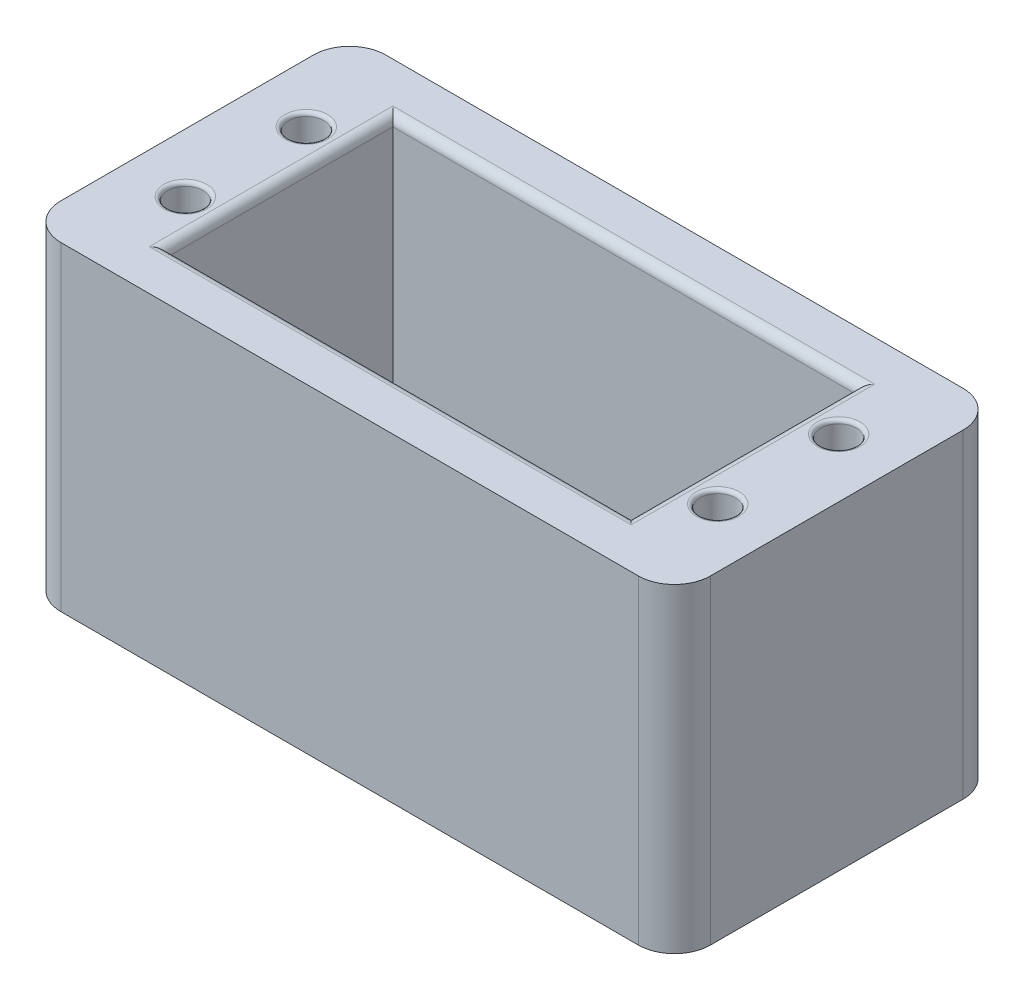
ISO-10303-21;
HEADER;
FILE_DESCRIPTION(('STEP AP214'),'2;1');
FILE_NAME('part.step','',(''),(''),'','','');
FILE_SCHEMA(('AUTOMOTIVE_DESIGN { 1 0 10303 214 1 1 1 1 }'));
ENDSEC;
DATA;
#1=APPLICATION_CONTEXT('core data for automotive mechanical design processes');
#2=APPLICATION_PROTOCOL_DEFINITION('international standard','automotive_design',2000,#1);
#3=PRODUCT_CONTEXT('',#1,'mechanical');
#4=PRODUCT('Part','Part','',(#3));
#5=PRODUCT_RELATED_PRODUCT_CATEGORY('part','',(#4));
#6=PRODUCT_DEFINITION_FORMATION('','',#4);
#7=PRODUCT_DEFINITION_CONTEXT('part definition',#1,'design');
#8=PRODUCT_DEFINITION('design','',#6,#7);
#9=PRODUCT_DEFINITION_SHAPE('','',#8);
#10=(LENGTH_UNIT() NAMED_UNIT(*) SI_UNIT(.MILLI.,.METRE.));
#11=(NAMED_UNIT(*) PLANE_ANGLE_UNIT() SI_UNIT($,.RADIAN.));
#12=(NAMED_UNIT(*) SI_UNIT($,.STERADIAN.) SOLID_ANGLE_UNIT());
#13=UNCERTAINTY_MEASURE_WITH_UNIT(LENGTH_MEASURE(1.E-05),#10,'distance_accuracy_value','');
#14=(GEOMETRIC_REPRESENTATION_CONTEXT(3) GLOBAL_UNCERTAINTY_ASSIGNED_CONTEXT((#13)) GLOBAL_UNIT_ASSIGNED_CONTEXT((#10,
#11,#12)) REPRESENTATION_CONTEXT('',''));
#15=CARTESIAN_POINT('',(0.,0.,0.));
#16=DIRECTION('',(0.,0.,1.));
#17=DIRECTION('',(1.,0.,0.));
#18=AXIS2_PLACEMENT_3D('',#15,#16,#17);
#19=CARTESIAN_POINT('',(45.72,45.,-22.86));
#20=DIRECTION('',(-1.,0.,0.));
#21=DIRECTION('',(0.,0.,1.));
#22=AXIS2_PLACEMENT_3D('',#19,#20,#21);
#23=PLANE('',#22);
#24=DIRECTION('',(0.,0.,-1.));
#25=VECTOR('',#24,1.);
#26=CARTESIAN_POINT('',(45.72,45.,-22.86));
#27=LINE('',#26,#25);
#28=CARTESIAN_POINT('',(45.72,45.,17.78));
#29=VERTEX_POINT('',#28);
#30=CARTESIAN_POINT('',(45.72,45.,-17.78));
#31=VERTEX_POINT('',#30);
#32=EDGE_CURVE('E174',#29,#31,#27,.T.);
#33=ORIENTED_EDGE('',*,*,#32,.F.);
#34=DIRECTION('',(0.,-1.,0.));
#35=VECTOR('',#34,1.);
#36=CARTESIAN_POINT('',(45.72,45.,17.78));
#37=LINE('',#36,#35);
#38=CARTESIAN_POINT('',(45.72,0.,17.78));
#39=VERTEX_POINT('',#38);
#40=EDGE_CURVE('E230',#29,#39,#37,.T.);
#41=ORIENTED_EDGE('',*,*,#40,.T.);
#42=DIRECTION('',(0.,0.,-1.));
#43=VECTOR('',#42,1.);
#44=CARTESIAN_POINT('',(45.72,0.,-22.86));
#45=LINE('',#44,#43);
#46=CARTESIAN_POINT('',(45.72,0.,-17.78));
#47=VERTEX_POINT('',#46);
#48=EDGE_CURVE('E170',#39,#47,#45,.T.);
#49=ORIENTED_EDGE('',*,*,#48,.T.);
#50=DIRECTION('',(0.,-1.,0.));
#51=VECTOR('',#50,1.);
#52=CARTESIAN_POINT('',(45.72,45.,-17.78));
#53=LINE('',#52,#51);
#54=EDGE_CURVE('E228',#47,#31,#53,.F.);
#55=ORIENTED_EDGE('',*,*,#54,.T.);
#56=EDGE_LOOP('',(#33,#41,#49,#55));
#57=FACE_BOUND('',#56,.T.);
#58=ADVANCED_FACE('F37',(#57),#23,.F.);
#59=CARTESIAN_POINT('',(-45.72,45.,-22.86));
#60=DIRECTION('',(0.,0.,1.));
#61=DIRECTION('',(1.,0.,0.));
#62=AXIS2_PLACEMENT_3D('',#59,#60,#61);
#63=PLANE('',#62);
#64=DIRECTION('',(-1.,0.,0.));
#65=VECTOR('',#64,1.);
#66=CARTESIAN_POINT('',(-45.72,0.,-22.86));
#67=LINE('',#66,#65);
#68=CARTESIAN_POINT('',(40.64,0.,-22.86));
#69=VERTEX_POINT('',#68);
#70=CARTESIAN_POINT('',(-40.64,0.,-22.86));
#71=VERTEX_POINT('',#70);
#72=EDGE_CURVE('E190',#69,#71,#67,.T.);
#73=ORIENTED_EDGE('',*,*,#72,.T.);
#74=DIRECTION('',(0.,-1.,0.));
#75=VECTOR('',#74,1.);
#76=CARTESIAN_POINT('',(-40.64,45.,-22.86));
#77=LINE('',#76,#75);
#78=CARTESIAN_POINT('',(-40.64,45.,-22.86));
#79=VERTEX_POINT('',#78);
#80=EDGE_CURVE('E226',#71,#79,#77,.F.);
#81=ORIENTED_EDGE('',*,*,#80,.T.);
#82=DIRECTION('',(-1.,0.,0.));
#83=VECTOR('',#82,1.);
#84=CARTESIAN_POINT('',(-45.72,45.,-22.86));
#85=LINE('',#84,#83);
#86=CARTESIAN_POINT('',(40.64,45.,-22.86));
#87=VERTEX_POINT('',#86);
#88=EDGE_CURVE('E177',#87,#79,#85,.T.);
#89=ORIENTED_EDGE('',*,*,#88,.F.);
#90=DIRECTION('',(0.,-1.,0.));
#91=VECTOR('',#90,1.);
#92=CARTESIAN_POINT('',(40.64,45.,-22.86));
#93=LINE('',#92,#91);
#94=EDGE_CURVE('E223',#87,#69,#93,.T.);
#95=ORIENTED_EDGE('',*,*,#94,.T.);
#96=EDGE_LOOP('',(#73,#81,#89,#95));
#97=FACE_BOUND('',#96,.T.);
#98=ADVANCED_FACE('F297',(#97),#63,.F.);
#99=CARTESIAN_POINT('',(-45.72,45.,-22.86));
#100=DIRECTION('',(1.,0.,0.));
#101=DIRECTION('',(0.,0.,-1.));
#102=AXIS2_PLACEMENT_3D('',#99,#100,#101);
#103=PLANE('',#102);
#104=DIRECTION('',(0.,0.,1.));
#105=VECTOR('',#104,1.);
#106=CARTESIAN_POINT('',(-45.72,0.,-22.86));
#107=LINE('',#106,#105);
#108=CARTESIAN_POINT('',(-45.72,0.,-17.78));
#109=VERTEX_POINT('',#108);
#110=CARTESIAN_POINT('',(-45.72,0.,17.78));
#111=VERTEX_POINT('',#110);
#112=EDGE_CURVE('E193',#109,#111,#107,.T.);
#113=ORIENTED_EDGE('',*,*,#112,.T.);
#114=DIRECTION('',(0.,-1.,0.));
#115=VECTOR('',#114,1.);
#116=CARTESIAN_POINT('',(-45.72,45.,17.78));
#117=LINE('',#116,#115);
#118=CARTESIAN_POINT('',(-45.72,45.,17.78));
#119=VERTEX_POINT('',#118);
#120=EDGE_CURVE('E213',#111,#119,#117,.F.);
#121=ORIENTED_EDGE('',*,*,#120,.T.);
#122=DIRECTION('',(0.,0.,1.));
#123=VECTOR('',#122,1.);
#124=CARTESIAN_POINT('',(-45.72,45.,-22.86));
#125=LINE('',#124,#123);
#126=CARTESIAN_POINT('',(-45.72,45.,-17.78));
#127=VERTEX_POINT('',#126);
#128=EDGE_CURVE('E181',#127,#119,#125,.T.);
#129=ORIENTED_EDGE('',*,*,#128,.F.);
#130=DIRECTION('',(0.,-1.,0.));
#131=VECTOR('',#130,1.);
#132=CARTESIAN_POINT('',(-45.72,45.,-17.78));
#133=LINE('',#132,#131);
#134=EDGE_CURVE('E210',#127,#109,#133,.T.);
#135=ORIENTED_EDGE('',*,*,#134,.T.);
#136=EDGE_LOOP('',(#113,#121,#129,#135));
#137=FACE_BOUND('',#136,.T.);
#138=ADVANCED_FACE('F303',(#137),#103,.F.);
#139=CARTESIAN_POINT('',(-45.72,45.,22.86));
#140=DIRECTION('',(0.,0.,-1.));
#141=DIRECTION('',(-1.,0.,0.));
#142=AXIS2_PLACEMENT_3D('',#139,#140,#141);
#143=PLANE('',#142);
#144=DIRECTION('',(1.,0.,0.));
#145=VECTOR('',#144,1.);
#146=CARTESIAN_POINT('',(-45.72,45.,22.86));
#147=LINE('',#146,#145);
#148=CARTESIAN_POINT('',(-40.64,45.,22.86));
#149=VERTEX_POINT('',#148);
#150=CARTESIAN_POINT('',(40.64,45.,22.86));
#151=VERTEX_POINT('',#150);
#152=EDGE_CURVE('E184',#149,#151,#147,.T.);
#153=ORIENTED_EDGE('',*,*,#152,.F.);
#154=DIRECTION('',(0.,-1.,0.));
#155=VECTOR('',#154,1.);
#156=CARTESIAN_POINT('',(-40.64,45.,22.86));
#157=LINE('',#156,#155);
#158=CARTESIAN_POINT('',(-40.64,0.,22.86));
#159=VERTEX_POINT('',#158);
#160=EDGE_CURVE('E199',#149,#159,#157,.T.);
#161=ORIENTED_EDGE('',*,*,#160,.T.);
#162=DIRECTION('',(1.,0.,0.));
#163=VECTOR('',#162,1.);
#164=CARTESIAN_POINT('',(-45.72,0.,22.86));
#165=LINE('',#164,#163);
#166=CARTESIAN_POINT('',(40.64,0.,22.86));
#167=VERTEX_POINT('',#166);
#168=EDGE_CURVE('E178',#159,#167,#165,.T.);
#169=ORIENTED_EDGE('',*,*,#168,.T.);
#170=DIRECTION('',(0.,-1.,0.));
#171=VECTOR('',#170,1.);
#172=CARTESIAN_POINT('',(40.64,45.,22.86));
#173=LINE('',#172,#171);
#174=EDGE_CURVE('E187',#167,#151,#173,.F.);
#175=ORIENTED_EDGE('',*,*,#174,.T.);
#176=EDGE_LOOP('',(#153,#161,#169,#175));
#177=FACE_BOUND('',#176,.T.);
#178=ADVANCED_FACE('F403',(#177),#143,.F.);
#179=CARTESIAN_POINT('',(0.,45.,0.));
#180=DIRECTION('',(0.,1.,0.));
#181=DIRECTION('',(0.,0.,1.));
#182=AXIS2_PLACEMENT_3D('',#179,#180,#181);
#183=PLANE('',#182);
#184=CARTESIAN_POINT('',(-37.465,45.,8.509));
#185=DIRECTION('',(0.,1.,0.));
#186=DIRECTION('',(0.,0.,1.));
#187=AXIS2_PLACEMENT_3D('',#184,#185,#186);
#188=CIRCLE('',#187,3.008);
#189=CARTESIAN_POINT('',(-37.465,45.,11.517));
#190=VERTEX_POINT('',#189);
#191=EDGE_CURVE('E272',#190,#190,#188,.F.);
#192=ORIENTED_EDGE('',*,*,#191,.T.);
#193=EDGE_LOOP('',(#192));
#194=FACE_BOUND('',#193,.T.);
#195=CARTESIAN_POINT('',(-37.465,45.,-8.509));
#196=DIRECTION('',(0.,1.,0.));
#197=DIRECTION('',(0.,0.,1.));
#198=AXIS2_PLACEMENT_3D('',#195,#196,#197);
#199=CIRCLE('',#198,3.008);
#200=CARTESIAN_POINT('',(-37.465,45.,-5.501));
#201=VERTEX_POINT('',#200);
#202=EDGE_CURVE('E269',#201,#201,#199,.F.);
#203=ORIENTED_EDGE('',*,*,#202,.T.);
#204=EDGE_LOOP('',(#203));
#205=FACE_BOUND('',#204,.T.);
#206=CARTESIAN_POINT('',(37.465,45.,8.509));
#207=DIRECTION('',(0.,1.,0.));
#208=DIRECTION('',(0.,0.,1.));
#209=AXIS2_PLACEMENT_3D('',#206,#207,#208);
#210=CIRCLE('',#209,3.008);
#211=CARTESIAN_POINT('',(37.465,45.,11.517));
#212=VERTEX_POINT('',#211);
#213=EDGE_CURVE('E266',#212,#212,#210,.F.);
#214=ORIENTED_EDGE('',*,*,#213,.T.);
#215=EDGE_LOOP('',(#214));
#216=FACE_BOUND('',#215,.T.);
#217=CARTESIAN_POINT('',(37.465,45.,-8.509));
#218=DIRECTION('',(0.,1.,0.));
#219=DIRECTION('',(0.,0.,1.));
#220=AXIS2_PLACEMENT_3D('',#217,#218,#219);
#221=CIRCLE('',#220,3.008);
#222=CARTESIAN_POINT('',(37.465,45.,-5.501));
#223=VERTEX_POINT('',#222);
#224=EDGE_CURVE('E263',#223,#223,#221,.F.);
#225=ORIENTED_EDGE('',*,*,#224,.T.);
#226=EDGE_LOOP('',(#225));
#227=FACE_BOUND('',#226,.T.);
#228=DIRECTION('',(1.,0.,0.));
#229=VECTOR('',#228,1.);
#230=CARTESIAN_POINT('',(-32.639,45.,17.145));
#231=LINE('',#230,#229);
#232=CARTESIAN_POINT('',(33.909,45.,17.145));
#233=VERTEX_POINT('',#232);
#234=CARTESIAN_POINT('',(-33.909,45.,17.145));
#235=VERTEX_POINT('',#234);
#236=EDGE_CURVE('E240',#233,#235,#231,.F.);
#237=ORIENTED_EDGE('',*,*,#236,.T.);
#238=DIRECTION('',(0.,0.,1.));
#239=VECTOR('',#238,1.);
#240=CARTESIAN_POINT('',(-33.909,45.,-15.875));
#241=LINE('',#240,#239);
#242=CARTESIAN_POINT('',(-33.909,45.,-17.145));
#243=VERTEX_POINT('',#242);
#244=EDGE_CURVE('E242',#235,#243,#241,.F.);
#245=ORIENTED_EDGE('',*,*,#244,.T.);
#246=DIRECTION('',(-1.,0.,0.));
#247=VECTOR('',#246,1.);
#248=CARTESIAN_POINT('',(32.639,45.,-17.145));
#249=LINE('',#248,#247);
#250=CARTESIAN_POINT('',(33.909,45.,-17.145));
#251=VERTEX_POINT('',#250);
#252=EDGE_CURVE('E236',#243,#251,#249,.F.);
#253=ORIENTED_EDGE('',*,*,#252,.T.);
#254=DIRECTION('',(0.,0.,-1.));
#255=VECTOR('',#254,1.);
#256=CARTESIAN_POINT('',(33.909,45.,15.875));
#257=LINE('',#256,#255);
#258=EDGE_CURVE('E238',#251,#233,#257,.F.);
#259=ORIENTED_EDGE('',*,*,#258,.T.);
#260=EDGE_LOOP('',(#237,#245,#253,#259));
#261=FACE_BOUND('',#260,.T.);
#262=ORIENTED_EDGE('',*,*,#128,.T.);
#263=CARTESIAN_POINT('',(-40.64,45.,17.78));
#264=DIRECTION('',(0.,1.,0.));
#265=DIRECTION('',(0.,0.,1.));
#266=AXIS2_PLACEMENT_3D('',#263,#264,#265);
#267=CIRCLE('',#266,5.08);
#268=EDGE_CURVE('E221',#119,#149,#267,.T.);
#269=ORIENTED_EDGE('',*,*,#268,.T.);
#270=ORIENTED_EDGE('',*,*,#152,.T.);
#271=CARTESIAN_POINT('',(40.64,45.,17.78));
#272=DIRECTION('',(0.,1.,0.));
#273=DIRECTION('',(0.,0.,1.));
#274=AXIS2_PLACEMENT_3D('',#271,#272,#273);
#275=CIRCLE('',#274,5.08);
#276=EDGE_CURVE('E217',#151,#29,#275,.T.);
#277=ORIENTED_EDGE('',*,*,#276,.T.);
#278=ORIENTED_EDGE('',*,*,#32,.T.);
#279=CARTESIAN_POINT('',(40.64,45.,-17.78));
#280=DIRECTION('',(0.,1.,0.));
#281=DIRECTION('',(0.,0.,1.));
#282=AXIS2_PLACEMENT_3D('',#279,#280,#281);
#283=CIRCLE('',#282,5.08);
#284=EDGE_CURVE('E215',#31,#87,#283,.T.);
#285=ORIENTED_EDGE('',*,*,#284,.T.);
#286=ORIENTED_EDGE('',*,*,#88,.T.);
#287=CARTESIAN_POINT('',(-40.64,45.,-17.78));
#288=DIRECTION('',(0.,1.,0.));
#289=DIRECTION('',(0.,0.,1.));
#290=AXIS2_PLACEMENT_3D('',#287,#288,#289);
#291=CIRCLE('',#290,5.08);
#292=EDGE_CURVE('E219',#79,#127,#291,.T.);
#293=ORIENTED_EDGE('',*,*,#292,.T.);
#294=EDGE_LOOP('',(#262,#269,#270,#277,#278,#285,#286,#293));
#295=FACE_BOUND('',#294,.T.);
#296=ADVANCED_FACE('F400',(#194,#205,#216,#227,#261,#295),#183,.T.);
#297=CARTESIAN_POINT('',(0.,0.,0.));
#298=DIRECTION('',(0.,1.,0.));
#299=DIRECTION('',(0.,0.,1.));
#300=AXIS2_PLACEMENT_3D('',#297,#298,#299);
#301=PLANE('',#300);
#302=ORIENTED_EDGE('',*,*,#168,.F.);
#303=CARTESIAN_POINT('',(-40.64,0.,17.78));
#304=DIRECTION('',(0.,1.,0.));
#305=DIRECTION('',(0.,0.,1.));
#306=AXIS2_PLACEMENT_3D('',#303,#304,#305);
#307=CIRCLE('',#306,5.08);
#308=EDGE_CURVE('E208',#159,#111,#307,.F.);
#309=ORIENTED_EDGE('',*,*,#308,.T.);
#310=ORIENTED_EDGE('',*,*,#112,.F.);
#311=CARTESIAN_POINT('',(-40.64,0.,-17.78));
#312=DIRECTION('',(0.,1.,0.));
#313=DIRECTION('',(0.,0.,1.));
#314=AXIS2_PLACEMENT_3D('',#311,#312,#313);
#315=CIRCLE('',#314,5.08);
#316=EDGE_CURVE('E206',#109,#71,#315,.F.);
#317=ORIENTED_EDGE('',*,*,#316,.T.);
#318=ORIENTED_EDGE('',*,*,#72,.F.);
#319=CARTESIAN_POINT('',(40.64,0.,-17.78));
#320=DIRECTION('',(0.,1.,0.));
#321=DIRECTION('',(0.,0.,1.));
#322=AXIS2_PLACEMENT_3D('',#319,#320,#321);
#323=CIRCLE('',#322,5.08);
#324=EDGE_CURVE('E202',#69,#47,#323,.F.);
#325=ORIENTED_EDGE('',*,*,#324,.T.);
#326=ORIENTED_EDGE('',*,*,#48,.F.);
#327=CARTESIAN_POINT('',(40.64,0.,17.78));
#328=DIRECTION('',(0.,1.,0.));
#329=DIRECTION('',(0.,0.,1.));
#330=AXIS2_PLACEMENT_3D('',#327,#328,#329);
#331=CIRCLE('',#330,5.08);
#332=EDGE_CURVE('E204',#39,#167,#331,.F.);
#333=ORIENTED_EDGE('',*,*,#332,.T.);
#334=EDGE_LOOP('',(#302,#309,#310,#317,#318,#325,#326,#333));
#335=FACE_BOUND('',#334,.T.);
#336=ADVANCED_FACE('F399',(#335),#301,.F.);
#337=CARTESIAN_POINT('',(32.639,5.,-15.875));
#338=DIRECTION('',(1.,0.,0.));
#339=DIRECTION('',(0.,0.,-1.));
#340=AXIS2_PLACEMENT_3D('',#337,#338,#339);
#341=PLANE('',#340);
#342=DIRECTION('',(0.,1.,0.));
#343=VECTOR('',#342,1.);
#344=CARTESIAN_POINT('',(32.639,5.,15.875));
#345=LINE('',#344,#343);
#346=CARTESIAN_POINT('',(32.639,5.,15.875));
#347=VERTEX_POINT('',#346);
#348=CARTESIAN_POINT('',(32.639,43.73,15.875));
#349=VERTEX_POINT('',#348);
#350=EDGE_CURVE('E168',#347,#349,#345,.T.);
#351=ORIENTED_EDGE('',*,*,#350,.T.);
#352=DIRECTION('',(0.,0.,-1.));
#353=VECTOR('',#352,1.);
#354=CARTESIAN_POINT('',(32.639,43.73,-15.875));
#355=LINE('',#354,#353);
#356=CARTESIAN_POINT('',(32.639,43.73,-15.875));
#357=VERTEX_POINT('',#356);
#358=EDGE_CURVE('E52',#349,#357,#355,.T.);
#359=ORIENTED_EDGE('',*,*,#358,.T.);
#360=DIRECTION('',(0.,1.,0.));
#361=VECTOR('',#360,1.);
#362=CARTESIAN_POINT('',(32.639,5.,-15.875));
#363=LINE('',#362,#361);
#364=CARTESIAN_POINT('',(32.639,5.,-15.875));
#365=VERTEX_POINT('',#364);
#366=EDGE_CURVE('E137',#365,#357,#363,.T.);
#367=ORIENTED_EDGE('',*,*,#366,.F.);
#368=DIRECTION('',(0.,0.,-1.));
#369=VECTOR('',#368,1.);
#370=CARTESIAN_POINT('',(32.639,5.,-15.875));
#371=LINE('',#370,#369);
#372=EDGE_CURVE('E141',#347,#365,#371,.T.);
#373=ORIENTED_EDGE('',*,*,#372,.F.);
#374=EDGE_LOOP('',(#351,#359,#367,#373));
#375=FACE_BOUND('',#374,.T.);
#376=ADVANCED_FACE('F139',(#375),#341,.F.);
#377=CARTESIAN_POINT('',(-32.639,5.,15.875));
#378=DIRECTION('',(0.,0.,1.));
#379=DIRECTION('',(1.,0.,0.));
#380=AXIS2_PLACEMENT_3D('',#377,#378,#379);
#381=PLANE('',#380);
#382=DIRECTION('',(0.,1.,0.));
#383=VECTOR('',#382,1.);
#384=CARTESIAN_POINT('',(-32.639,5.,15.875));
#385=LINE('',#384,#383);
#386=CARTESIAN_POINT('',(-32.639,5.,15.875));
#387=VERTEX_POINT('',#386);
#388=CARTESIAN_POINT('',(-32.639,43.73,15.875));
#389=VERTEX_POINT('',#388);
#390=EDGE_CURVE('E171',#387,#389,#385,.T.);
#391=ORIENTED_EDGE('',*,*,#390,.T.);
#392=DIRECTION('',(1.,0.,0.));
#393=VECTOR('',#392,1.);
#394=CARTESIAN_POINT('',(32.639,43.73,15.875));
#395=LINE('',#394,#393);
#396=EDGE_CURVE('E60',#389,#349,#395,.T.);
#397=ORIENTED_EDGE('',*,*,#396,.T.);
#398=ORIENTED_EDGE('',*,*,#350,.F.);
#399=DIRECTION('',(1.,0.,0.));
#400=VECTOR('',#399,1.);
#401=CARTESIAN_POINT('',(-32.639,5.,15.875));
#402=LINE('',#401,#400);
#403=EDGE_CURVE('E146',#387,#347,#402,.T.);
#404=ORIENTED_EDGE('',*,*,#403,.F.);
#405=EDGE_LOOP('',(#391,#397,#398,#404));
#406=FACE_BOUND('',#405,.T.);
#407=ADVANCED_FACE('F388',(#406),#381,.F.);
#408=CARTESIAN_POINT('',(-32.639,5.,-15.875));
#409=DIRECTION('',(-1.,0.,0.));
#410=DIRECTION('',(0.,0.,1.));
#411=AXIS2_PLACEMENT_3D('',#408,#409,#410);
#412=PLANE('',#411);
#413=DIRECTION('',(0.,1.,0.));
#414=VECTOR('',#413,1.);
#415=CARTESIAN_POINT('',(-32.639,5.,-15.875));
#416=LINE('',#415,#414);
#417=CARTESIAN_POINT('',(-32.639,5.,-15.875));
#418=VERTEX_POINT('',#417);
#419=CARTESIAN_POINT('',(-32.639,43.73,-15.875));
#420=VERTEX_POINT('',#419);
#421=EDGE_CURVE('E145',#418,#420,#416,.T.);
#422=ORIENTED_EDGE('',*,*,#421,.T.);
#423=DIRECTION('',(0.,0.,1.));
#424=VECTOR('',#423,1.);
#425=CARTESIAN_POINT('',(-32.639,43.73,15.875));
#426=LINE('',#425,#424);
#427=EDGE_CURVE('E233',#420,#389,#426,.T.);
#428=ORIENTED_EDGE('',*,*,#427,.T.);
#429=ORIENTED_EDGE('',*,*,#390,.F.);
#430=DIRECTION('',(0.,0.,1.));
#431=VECTOR('',#430,1.);
#432=CARTESIAN_POINT('',(-32.639,5.,-15.875));
#433=LINE('',#432,#431);
#434=EDGE_CURVE('E155',#418,#387,#433,.T.);
#435=ORIENTED_EDGE('',*,*,#434,.F.);
#436=EDGE_LOOP('',(#422,#428,#429,#435));
#437=FACE_BOUND('',#436,.T.);
#438=ADVANCED_FACE('F391',(#437),#412,.F.);
#439=CARTESIAN_POINT('',(-32.639,5.,-15.875));
#440=DIRECTION('',(0.,0.,-1.));
#441=DIRECTION('',(-1.,0.,0.));
#442=AXIS2_PLACEMENT_3D('',#439,#440,#441);
#443=PLANE('',#442);
#444=ORIENTED_EDGE('',*,*,#366,.T.);
#445=DIRECTION('',(-1.,0.,0.));
#446=VECTOR('',#445,1.);
#447=CARTESIAN_POINT('',(-32.639,43.73,-15.875));
#448=LINE('',#447,#446);
#449=EDGE_CURVE('E247',#357,#420,#448,.T.);
#450=ORIENTED_EDGE('',*,*,#449,.T.);
#451=ORIENTED_EDGE('',*,*,#421,.F.);
#452=DIRECTION('',(-1.,0.,0.));
#453=VECTOR('',#452,1.);
#454=CARTESIAN_POINT('',(-32.639,5.,-15.875));
#455=LINE('',#454,#453);
#456=EDGE_CURVE('E149',#365,#418,#455,.T.);
#457=ORIENTED_EDGE('',*,*,#456,.F.);
#458=EDGE_LOOP('',(#444,#450,#451,#457));
#459=FACE_BOUND('',#458,.T.);
#460=ADVANCED_FACE('F150',(#459),#443,.F.);
#461=CARTESIAN_POINT('',(0.,5.,0.));
#462=DIRECTION('',(0.,1.,0.));
#463=DIRECTION('',(0.,0.,1.));
#464=AXIS2_PLACEMENT_3D('',#461,#462,#463);
#465=PLANE('',#464);
#466=ORIENTED_EDGE('',*,*,#372,.T.);
#467=ORIENTED_EDGE('',*,*,#456,.T.);
#468=ORIENTED_EDGE('',*,*,#434,.T.);
#469=ORIENTED_EDGE('',*,*,#403,.T.);
#470=EDGE_LOOP('',(#466,#467,#468,#469));
#471=FACE_BOUND('',#470,.T.);
#472=ADVANCED_FACE('F157',(#471),#465,.T.);
#473=CARTESIAN_POINT('',(37.465,19.6,-8.509));
#474=DIRECTION('',(0.,1.,0.));
#475=DIRECTION('',(0.,0.,1.));
#476=AXIS2_PLACEMENT_3D('',#473,#474,#475);
#477=CYLINDRICAL_SURFACE('',#476,2.5);
#478=CARTESIAN_POINT('',(37.465,44.492,-8.509));
#479=DIRECTION('',(0.,1.,0.));
#480=DIRECTION('',(0.,0.,1.));
#481=AXIS2_PLACEMENT_3D('',#478,#479,#480);
#482=CIRCLE('',#481,2.5);
#483=CARTESIAN_POINT('',(37.465,44.492,-6.009));
#484=VERTEX_POINT('',#483);
#485=EDGE_CURVE('E11',#484,#484,#482,.T.);
#486=ORIENTED_EDGE('',*,*,#485,.T.);
#487=EDGE_LOOP('',(#486));
#488=FACE_BOUND('',#487,.T.);
#489=CARTESIAN_POINT('',(37.465,19.6,-8.509));
#490=DIRECTION('',(0.,1.,0.));
#491=DIRECTION('',(0.,0.,1.));
#492=AXIS2_PLACEMENT_3D('',#489,#490,#491);
#493=CIRCLE('',#492,2.5);
#494=CARTESIAN_POINT('',(37.465,19.6,-6.009));
#495=VERTEX_POINT('',#494);
#496=EDGE_CURVE('E159',#495,#495,#493,.T.);
#497=ORIENTED_EDGE('',*,*,#496,.F.);
#498=EDGE_LOOP('',(#497));
#499=FACE_BOUND('',#498,.T.);
#500=ADVANCED_FACE('F381',(#488,#499),#477,.F.);
#501=CARTESIAN_POINT('',(37.465,19.6,-8.509));
#502=DIRECTION('',(0.,1.,0.));
#503=DIRECTION('',(0.,0.,1.));
#504=AXIS2_PLACEMENT_3D('',#501,#502,#503);
#505=PLANE('',#504);
#506=ORIENTED_EDGE('',*,*,#496,.T.);
#507=EDGE_LOOP('',(#506));
#508=FACE_BOUND('',#507,.T.);
#509=ADVANCED_FACE('F378',(#508),#505,.T.);
#510=CARTESIAN_POINT('',(37.465,19.6,8.509));
#511=DIRECTION('',(0.,1.,0.));
#512=DIRECTION('',(0.,0.,1.));
#513=AXIS2_PLACEMENT_3D('',#510,#511,#512);
#514=CYLINDRICAL_SURFACE('',#513,2.5);
#515=CARTESIAN_POINT('',(37.465,44.492,8.509));
#516=DIRECTION('',(0.,1.,0.));
#517=DIRECTION('',(0.,0.,1.));
#518=AXIS2_PLACEMENT_3D('',#515,#516,#517);
#519=CIRCLE('',#518,2.5);
#520=CARTESIAN_POINT('',(37.465,44.492,11.009));
#521=VERTEX_POINT('',#520);
#522=EDGE_CURVE('E45',#521,#521,#519,.T.);
#523=ORIENTED_EDGE('',*,*,#522,.T.);
#524=EDGE_LOOP('',(#523));
#525=FACE_BOUND('',#524,.T.);
#526=CARTESIAN_POINT('',(37.465,19.6,8.509));
#527=DIRECTION('',(0.,1.,0.));
#528=DIRECTION('',(0.,0.,1.));
#529=AXIS2_PLACEMENT_3D('',#526,#527,#528);
#530=CIRCLE('',#529,2.5);
#531=CARTESIAN_POINT('',(37.465,19.6,11.009));
#532=VERTEX_POINT('',#531);
#533=EDGE_CURVE('E162',#532,#532,#530,.T.);
#534=ORIENTED_EDGE('',*,*,#533,.F.);
#535=EDGE_LOOP('',(#534));
#536=FACE_BOUND('',#535,.T.);
#537=ADVANCED_FACE('F280',(#525,#536),#514,.F.);
#538=CARTESIAN_POINT('',(37.465,19.6,8.509));
#539=DIRECTION('',(0.,1.,0.));
#540=DIRECTION('',(0.,0.,1.));
#541=AXIS2_PLACEMENT_3D('',#538,#539,#540);
#542=PLANE('',#541);
#543=ORIENTED_EDGE('',*,*,#533,.T.);
#544=EDGE_LOOP('',(#543));
#545=FACE_BOUND('',#544,.T.);
#546=ADVANCED_FACE('F354',(#545),#542,.T.);
#547=CARTESIAN_POINT('',(-37.465,19.6,8.509));
#548=DIRECTION('',(0.,1.,0.));
#549=DIRECTION('',(0.,0.,1.));
#550=AXIS2_PLACEMENT_3D('',#547,#548,#549);
#551=CYLINDRICAL_SURFACE('',#550,2.5);
#552=CARTESIAN_POINT('',(-37.465,44.492,8.509));
#553=DIRECTION('',(0.,1.,0.));
#554=DIRECTION('',(0.,0.,1.));
#555=AXIS2_PLACEMENT_3D('',#552,#553,#554);
#556=CIRCLE('',#555,2.5);
#557=CARTESIAN_POINT('',(-37.465,44.492,11.009));
#558=VERTEX_POINT('',#557);
#559=EDGE_CURVE('E249',#558,#558,#556,.T.);
#560=ORIENTED_EDGE('',*,*,#559,.T.);
#561=EDGE_LOOP('',(#560));
#562=FACE_BOUND('',#561,.T.);
#563=CARTESIAN_POINT('',(-37.465,19.6,8.509));
#564=DIRECTION('',(0.,1.,0.));
#565=DIRECTION('',(0.,0.,-1.));
#566=AXIS2_PLACEMENT_3D('',#563,#564,#565);
#567=CIRCLE('',#566,2.5);
#568=CARTESIAN_POINT('',(-37.465,19.6,6.009));
#569=VERTEX_POINT('',#568);
#570=EDGE_CURVE('E358',#569,#569,#567,.T.);
#571=ORIENTED_EDGE('',*,*,#570,.F.);
#572=EDGE_LOOP('',(#571));
#573=FACE_BOUND('',#572,.T.);
#574=ADVANCED_FACE('F350',(#562,#573),#551,.F.);
#575=CARTESIAN_POINT('',(-37.465,19.6,8.509));
#576=DIRECTION('',(0.,-1.,0.));
#577=DIRECTION('',(0.,0.,-1.));
#578=AXIS2_PLACEMENT_3D('',#575,#576,#577);
#579=PLANE('',#578);
#580=ORIENTED_EDGE('',*,*,#570,.T.);
#581=EDGE_LOOP('',(#580));
#582=FACE_BOUND('',#581,.T.);
#583=ADVANCED_FACE('F353',(#582),#579,.F.);
#584=CARTESIAN_POINT('',(-37.465,19.6,-8.509));
#585=DIRECTION('',(0.,1.,0.));
#586=DIRECTION('',(0.,0.,1.));
#587=AXIS2_PLACEMENT_3D('',#584,#585,#586);
#588=CYLINDRICAL_SURFACE('',#587,2.5);
#589=CARTESIAN_POINT('',(-37.465,44.492,-8.509));
#590=DIRECTION('',(0.,1.,0.));
#591=DIRECTION('',(0.,0.,1.));
#592=AXIS2_PLACEMENT_3D('',#589,#590,#591);
#593=CIRCLE('',#592,2.5);
#594=CARTESIAN_POINT('',(-37.465,44.492,-6.009));
#595=VERTEX_POINT('',#594);
#596=EDGE_CURVE('E275',#595,#595,#593,.T.);
#597=ORIENTED_EDGE('',*,*,#596,.T.);
#598=EDGE_LOOP('',(#597));
#599=FACE_BOUND('',#598,.T.);
#600=CARTESIAN_POINT('',(-37.465,19.6,-8.509));
#601=DIRECTION('',(0.,1.,0.));
#602=DIRECTION('',(0.,0.,-1.));
#603=AXIS2_PLACEMENT_3D('',#600,#601,#602);
#604=CIRCLE('',#603,2.5);
#605=CARTESIAN_POINT('',(-37.465,19.6,-11.009));
#606=VERTEX_POINT('',#605);
#607=EDGE_CURVE('E260',#606,#606,#604,.T.);
#608=ORIENTED_EDGE('',*,*,#607,.F.);
#609=EDGE_LOOP('',(#608));
#610=FACE_BOUND('',#609,.T.);
#611=ADVANCED_FACE('F367',(#599,#610),#588,.F.);
#612=CARTESIAN_POINT('',(-37.465,19.6,-8.509));
#613=DIRECTION('',(0.,-1.,0.));
#614=DIRECTION('',(0.,0.,-1.));
#615=AXIS2_PLACEMENT_3D('',#612,#613,#614);
#616=PLANE('',#615);
#617=ORIENTED_EDGE('',*,*,#607,.T.);
#618=EDGE_LOOP('',(#617));
#619=FACE_BOUND('',#618,.T.);
#620=ADVANCED_FACE('F313',(#619),#616,.F.);
#621=CARTESIAN_POINT('',(-40.64,45.,17.78));
#622=DIRECTION('',(0.,-1.,0.));
#623=DIRECTION('',(0.,0.,-1.));
#624=AXIS2_PLACEMENT_3D('',#621,#622,#623);
#625=CYLINDRICAL_SURFACE('',#624,5.08);
#626=ORIENTED_EDGE('',*,*,#268,.F.);
#627=ORIENTED_EDGE('',*,*,#120,.F.);
#628=ORIENTED_EDGE('',*,*,#308,.F.);
#629=ORIENTED_EDGE('',*,*,#160,.F.);
#630=EDGE_LOOP('',(#626,#627,#628,#629));
#631=FACE_BOUND('',#630,.T.);
#632=ADVANCED_FACE('F309',(#631),#625,.T.);
#633=CARTESIAN_POINT('',(-40.64,45.,-17.78));
#634=DIRECTION('',(0.,-1.,0.));
#635=DIRECTION('',(0.,0.,-1.));
#636=AXIS2_PLACEMENT_3D('',#633,#634,#635);
#637=CYLINDRICAL_SURFACE('',#636,5.08);
#638=ORIENTED_EDGE('',*,*,#292,.F.);
#639=ORIENTED_EDGE('',*,*,#80,.F.);
#640=ORIENTED_EDGE('',*,*,#316,.F.);
#641=ORIENTED_EDGE('',*,*,#134,.F.);
#642=EDGE_LOOP('',(#638,#639,#640,#641));
#643=FACE_BOUND('',#642,.T.);
#644=ADVANCED_FACE('F312',(#643),#637,.T.);
#645=CARTESIAN_POINT('',(40.64,45.,17.78));
#646=DIRECTION('',(0.,-1.,0.));
#647=DIRECTION('',(0.,0.,-1.));
#648=AXIS2_PLACEMENT_3D('',#645,#646,#647);
#649=CYLINDRICAL_SURFACE('',#648,5.08);
#650=ORIENTED_EDGE('',*,*,#276,.F.);
#651=ORIENTED_EDGE('',*,*,#174,.F.);
#652=ORIENTED_EDGE('',*,*,#332,.F.);
#653=ORIENTED_EDGE('',*,*,#40,.F.);
#654=EDGE_LOOP('',(#650,#651,#652,#653));
#655=FACE_BOUND('',#654,.T.);
#656=ADVANCED_FACE('F317',(#655),#649,.T.);
#657=CARTESIAN_POINT('',(40.64,45.,-17.78));
#658=DIRECTION('',(0.,-1.,0.));
#659=DIRECTION('',(0.,0.,-1.));
#660=AXIS2_PLACEMENT_3D('',#657,#658,#659);
#661=CYLINDRICAL_SURFACE('',#660,5.08);
#662=ORIENTED_EDGE('',*,*,#284,.F.);
#663=ORIENTED_EDGE('',*,*,#54,.F.);
#664=ORIENTED_EDGE('',*,*,#324,.F.);
#665=ORIENTED_EDGE('',*,*,#94,.F.);
#666=EDGE_LOOP('',(#662,#663,#664,#665));
#667=FACE_BOUND('',#666,.T.);
#668=ADVANCED_FACE('F321',(#667),#661,.T.);
#669=CARTESIAN_POINT('',(33.909,43.73,-15.875));
#670=DIRECTION('',(0.,0.,1.));
#671=DIRECTION('',(1.,0.,0.));
#672=AXIS2_PLACEMENT_3D('',#669,#670,#671);
#673=CYLINDRICAL_SURFACE('',#672,1.27);
#674=CARTESIAN_POINT('',(33.909,43.73,17.145));
#675=DIRECTION('',(-0.707106781186547,0.,0.707106781186548));
#676=DIRECTION('',(-0.707106781186548,0.,-0.707106781186547));
#677=AXIS2_PLACEMENT_3D('',#674,#675,#676);
#678=ELLIPSE('',#677,1.79605122421383,1.27);
#679=EDGE_CURVE('E254',#233,#349,#678,.T.);
#680=ORIENTED_EDGE('',*,*,#679,.F.);
#681=ORIENTED_EDGE('',*,*,#258,.F.);
#682=CARTESIAN_POINT('',(33.909,43.73,-17.145));
#683=DIRECTION('',(0.707106781186548,0.,0.707106781186547));
#684=DIRECTION('',(-0.707106781186547,0.,0.707106781186548));
#685=AXIS2_PLACEMENT_3D('',#682,#683,#684);
#686=ELLIPSE('',#685,1.79605122421383,1.27);
#687=EDGE_CURVE('E257',#357,#251,#686,.F.);
#688=ORIENTED_EDGE('',*,*,#687,.F.);
#689=ORIENTED_EDGE('',*,*,#358,.F.);
#690=EDGE_LOOP('',(#680,#681,#688,#689));
#691=FACE_BOUND('',#690,.T.);
#692=ADVANCED_FACE('F325',(#691),#673,.T.);
#693=CARTESIAN_POINT('',(-32.639,43.73,-17.145));
#694=DIRECTION('',(1.,0.,0.));
#695=DIRECTION('',(0.,0.,-1.));
#696=AXIS2_PLACEMENT_3D('',#693,#694,#695);
#697=CYLINDRICAL_SURFACE('',#696,1.27);
#698=ORIENTED_EDGE('',*,*,#687,.T.);
#699=ORIENTED_EDGE('',*,*,#252,.F.);
#700=CARTESIAN_POINT('',(-33.909,43.73,-17.145));
#701=DIRECTION('',(0.707106781186547,0.,-0.707106781186548));
#702=DIRECTION('',(-0.707106781186548,0.,-0.707106781186547));
#703=AXIS2_PLACEMENT_3D('',#700,#701,#702);
#704=ELLIPSE('',#703,1.79605122421383,1.27);
#705=EDGE_CURVE('E252',#420,#243,#704,.F.);
#706=ORIENTED_EDGE('',*,*,#705,.F.);
#707=ORIENTED_EDGE('',*,*,#449,.F.);
#708=EDGE_LOOP('',(#698,#699,#706,#707));
#709=FACE_BOUND('',#708,.T.);
#710=ADVANCED_FACE('F334',(#709),#697,.T.);
#711=CARTESIAN_POINT('',(-32.639,43.73,17.145));
#712=DIRECTION('',(-1.,0.,0.));
#713=DIRECTION('',(0.,0.,1.));
#714=AXIS2_PLACEMENT_3D('',#711,#712,#713);
#715=CYLINDRICAL_SURFACE('',#714,1.27);
#716=ORIENTED_EDGE('',*,*,#679,.T.);
#717=ORIENTED_EDGE('',*,*,#396,.F.);
#718=CARTESIAN_POINT('',(-33.909,43.73,17.145));
#719=DIRECTION('',(-0.707106781186548,0.,-0.707106781186547));
#720=DIRECTION('',(0.707106781186547,0.,-0.707106781186548));
#721=AXIS2_PLACEMENT_3D('',#718,#719,#720);
#722=ELLIPSE('',#721,1.79605122421383,1.27);
#723=EDGE_CURVE('E250',#235,#389,#722,.T.);
#724=ORIENTED_EDGE('',*,*,#723,.F.);
#725=ORIENTED_EDGE('',*,*,#236,.F.);
#726=EDGE_LOOP('',(#716,#717,#724,#725));
#727=FACE_BOUND('',#726,.T.);
#728=ADVANCED_FACE('F330',(#727),#715,.T.);
#729=CARTESIAN_POINT('',(-33.909,43.73,-15.875));
#730=DIRECTION('',(0.,0.,-1.));
#731=DIRECTION('',(-1.,0.,0.));
#732=AXIS2_PLACEMENT_3D('',#729,#730,#731);
#733=CYLINDRICAL_SURFACE('',#732,1.27);
#734=ORIENTED_EDGE('',*,*,#705,.T.);
#735=ORIENTED_EDGE('',*,*,#244,.F.);
#736=ORIENTED_EDGE('',*,*,#723,.T.);
#737=ORIENTED_EDGE('',*,*,#427,.F.);
#738=EDGE_LOOP('',(#734,#735,#736,#737));
#739=FACE_BOUND('',#738,.T.);
#740=ADVANCED_FACE('F327',(#739),#733,.T.);
#741=CARTESIAN_POINT('',(-37.465,44.492,8.509));
#742=DIRECTION('',(0.,1.,0.));
#743=DIRECTION('',(0.,0.,1.));
#744=AXIS2_PLACEMENT_3D('',#741,#742,#743);
#745=TOROIDAL_SURFACE('',#744,3.008,0.508);
#746=ORIENTED_EDGE('',*,*,#191,.F.);
#747=EDGE_LOOP('',(#746));
#748=FACE_BOUND('',#747,.T.);
#749=ORIENTED_EDGE('',*,*,#559,.F.);
#750=EDGE_LOOP('',(#749));
#751=FACE_BOUND('',#750,.T.);
#752=ADVANCED_FACE('F292',(#748,#751),#745,.T.);
#753=CARTESIAN_POINT('',(-37.465,44.492,-8.509));
#754=DIRECTION('',(0.,1.,0.));
#755=DIRECTION('',(0.,0.,1.));
#756=AXIS2_PLACEMENT_3D('',#753,#754,#755);
#757=TOROIDAL_SURFACE('',#756,3.008,0.508);
#758=ORIENTED_EDGE('',*,*,#202,.F.);
#759=EDGE_LOOP('',(#758));
#760=FACE_BOUND('',#759,.T.);
#761=ORIENTED_EDGE('',*,*,#596,.F.);
#762=EDGE_LOOP('',(#761));
#763=FACE_BOUND('',#762,.T.);
#764=ADVANCED_FACE('F285',(#760,#763),#757,.T.);
#765=CARTESIAN_POINT('',(37.465,44.492,8.509));
#766=DIRECTION('',(0.,1.,0.));
#767=DIRECTION('',(0.,0.,1.));
#768=AXIS2_PLACEMENT_3D('',#765,#766,#767);
#769=TOROIDAL_SURFACE('',#768,3.008,0.508);
#770=ORIENTED_EDGE('',*,*,#213,.F.);
#771=EDGE_LOOP('',(#770));
#772=FACE_BOUND('',#771,.T.);
#773=ORIENTED_EDGE('',*,*,#522,.F.);
#774=EDGE_LOOP('',(#773));
#775=FACE_BOUND('',#774,.T.);
#776=ADVANCED_FACE('F283',(#772,#775),#769,.T.);
#777=CARTESIAN_POINT('',(37.465,44.492,-8.509));
#778=DIRECTION('',(0.,1.,0.));
#779=DIRECTION('',(0.,0.,1.));
#780=AXIS2_PLACEMENT_3D('',#777,#778,#779);
#781=TOROIDAL_SURFACE('',#780,3.008,0.508);
#782=ORIENTED_EDGE('',*,*,#224,.F.);
#783=EDGE_LOOP('',(#782));
#784=FACE_BOUND('',#783,.T.);
#785=ORIENTED_EDGE('',*,*,#485,.F.);
#786=EDGE_LOOP('',(#785));
#787=FACE_BOUND('',#786,.T.);
#788=ADVANCED_FACE('F39',(#784,#787),#781,.T.);
#789=CLOSED_SHELL('',(#58,#98,#138,#178,#296,#336,#376,#407,#438,#460,#472,#500,#509,#537,#546,
#574,#583,#611,#620,#632,#644,#656,#668,#692,#710,#728,#740,#752,#764,#776,#788));
#790=MANIFOLD_SOLID_BREP('B2',#789);
#791=ADVANCED_BREP_SHAPE_REPRESENTATION('',(#18,#790),#14);
#792=SHAPE_DEFINITION_REPRESENTATION(#9,#791);
ENDSEC;
END-ISO-10303-21;
